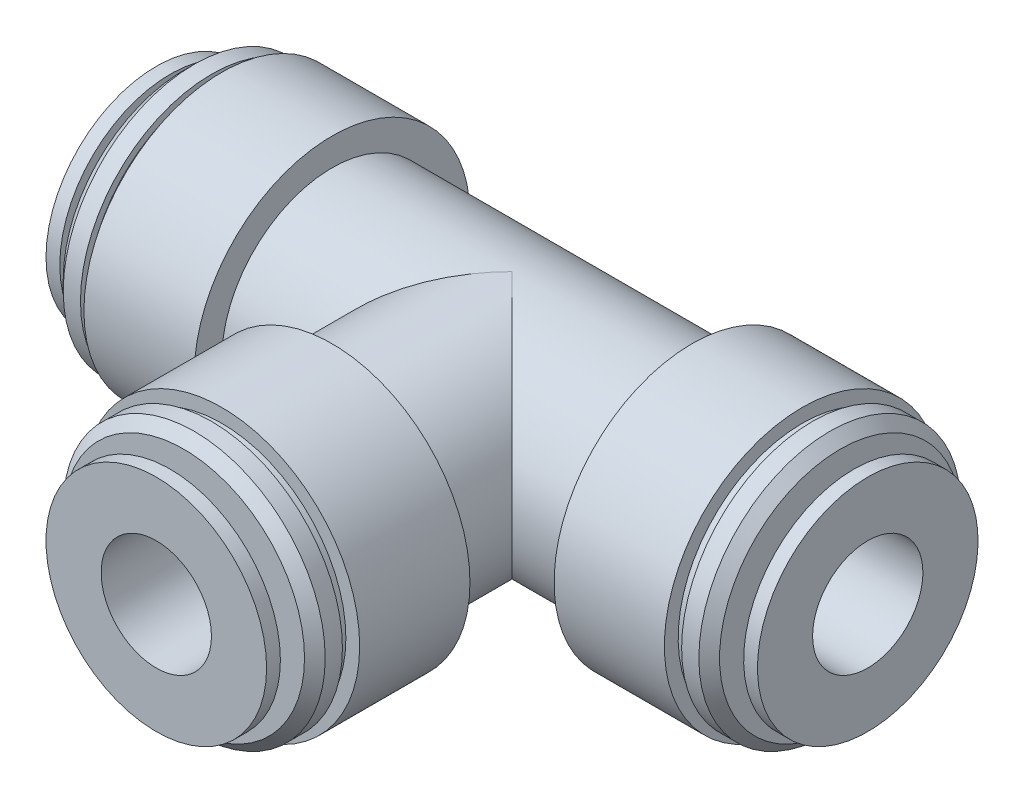
ISO-10303-21;
HEADER;
FILE_DESCRIPTION(('STEP AP214'),'2;1');
FILE_NAME('part.step','',(''),(''),'','','');
FILE_SCHEMA(('AUTOMOTIVE_DESIGN { 1 0 10303 214 1 1 1 1 }'));
ENDSEC;
DATA;
#1=APPLICATION_CONTEXT('core data for automotive mechanical design processes');
#2=APPLICATION_PROTOCOL_DEFINITION('international standard','automotive_design',2000,#1);
#3=PRODUCT_CONTEXT('',#1,'mechanical');
#4=PRODUCT('Part','Part','',(#3));
#5=PRODUCT_RELATED_PRODUCT_CATEGORY('part','',(#4));
#6=PRODUCT_DEFINITION_FORMATION('','',#4);
#7=PRODUCT_DEFINITION_CONTEXT('part definition',#1,'design');
#8=PRODUCT_DEFINITION('design','',#6,#7);
#9=PRODUCT_DEFINITION_SHAPE('','',#8);
#10=(LENGTH_UNIT() NAMED_UNIT(*) SI_UNIT(.MILLI.,.METRE.));
#11=(NAMED_UNIT(*) PLANE_ANGLE_UNIT() SI_UNIT($,.RADIAN.));
#12=(NAMED_UNIT(*) SI_UNIT($,.STERADIAN.) SOLID_ANGLE_UNIT());
#13=UNCERTAINTY_MEASURE_WITH_UNIT(LENGTH_MEASURE(1.E-05),#10,'distance_accuracy_value','');
#14=(GEOMETRIC_REPRESENTATION_CONTEXT(3) GLOBAL_UNCERTAINTY_ASSIGNED_CONTEXT((#13)) GLOBAL_UNIT_ASSIGNED_CONTEXT((#10,
#11,#12)) REPRESENTATION_CONTEXT('',''));
#15=CARTESIAN_POINT('',(0.,0.,0.));
#16=DIRECTION('',(0.,0.,1.));
#17=DIRECTION('',(1.,0.,0.));
#18=AXIS2_PLACEMENT_3D('',#15,#16,#17);
#19=CARTESIAN_POINT('',(-21.0494892323431,0.,0.));
#20=DIRECTION('',(-1.,0.,0.));
#21=DIRECTION('',(0.,0.,1.));
#22=AXIS2_PLACEMENT_3D('',#19,#20,#21);
#23=CYLINDRICAL_SURFACE('',#22,4.);
#24=CARTESIAN_POINT('',(-17.75,0.,0.));
#25=DIRECTION('',(-1.,0.,0.));
#26=DIRECTION('',(0.,0.,1.));
#27=AXIS2_PLACEMENT_3D('',#24,#25,#26);
#28=CIRCLE('',#27,4.);
#29=CARTESIAN_POINT('',(-17.75,0.,4.));
#30=VERTEX_POINT('',#29);
#31=EDGE_CURVE('E195',#30,#30,#28,.T.);
#32=ORIENTED_EDGE('',*,*,#31,.T.);
#33=EDGE_LOOP('',(#32));
#34=FACE_BOUND('',#33,.T.);
#35=CARTESIAN_POINT('',(33.8500000000001,0.,0.));
#36=DIRECTION('',(1.,0.,0.));
#37=DIRECTION('',(0.,1.,0.));
#38=AXIS2_PLACEMENT_3D('',#35,#36,#37);
#39=CIRCLE('',#38,3.99999999999978);
#40=CARTESIAN_POINT('',(33.8500000000001,3.99999999999987,0.));
#41=VERTEX_POINT('',#40);
#42=EDGE_CURVE('E152',#41,#41,#39,.T.);
#43=ORIENTED_EDGE('',*,*,#42,.T.);
#44=EDGE_LOOP('',(#43));
#45=FACE_BOUND('',#44,.T.);
#46=CARTESIAN_POINT('',(8.05000000000001,0.,0.));
#47=DIRECTION('',(-0.707106781186547,0.,0.707106781186547));
#48=DIRECTION('',(-0.707106781186547,0.,-0.707106781186547));
#49=AXIS2_PLACEMENT_3D('',#46,#47,#48);
#50=ELLIPSE('',#49,5.65685424949238,4.);
#51=CARTESIAN_POINT('',(8.85000000000001,3.91918358845309,0.799999999999988));
#52=VERTEX_POINT('',#51);
#53=CARTESIAN_POINT('',(8.85000000000001,-3.91918358845309,0.799999999999988));
#54=VERTEX_POINT('',#53);
#55=EDGE_CURVE('E76',#52,#54,#50,.F.);
#56=ORIENTED_EDGE('',*,*,#55,.F.);
#57=DIRECTION('',(-1.,0.,0.));
#58=VECTOR('',#57,1.);
#59=CARTESIAN_POINT('',(-21.0494892323431,3.91918358845309,0.799999999999988));
#60=LINE('',#59,#58);
#61=CARTESIAN_POINT('',(7.25000000000003,3.91918358845309,0.799999999999988));
#62=VERTEX_POINT('',#61);
#63=EDGE_CURVE('E11',#52,#62,#60,.T.);
#64=ORIENTED_EDGE('',*,*,#63,.T.);
#65=CARTESIAN_POINT('',(8.05000000000001,0.,0.));
#66=DIRECTION('',(-0.707106781186547,0.,-0.707106781186547));
#67=DIRECTION('',(-0.707106781186547,0.,0.707106781186547));
#68=AXIS2_PLACEMENT_3D('',#65,#66,#67);
#69=ELLIPSE('',#68,5.65685424949238,4.);
#70=CARTESIAN_POINT('',(7.25000000000003,-3.91918358845309,0.799999999999988));
#71=VERTEX_POINT('',#70);
#72=EDGE_CURVE('E78',#71,#62,#69,.T.);
#73=ORIENTED_EDGE('',*,*,#72,.F.);
#74=DIRECTION('',(-1.,0.,0.));
#75=VECTOR('',#74,1.);
#76=CARTESIAN_POINT('',(-21.0494892323431,-3.91918358845309,0.799999999999988));
#77=LINE('',#76,#75);
#78=EDGE_CURVE('E42',#71,#54,#77,.F.);
#79=ORIENTED_EDGE('',*,*,#78,.T.);
#80=EDGE_LOOP('',(#56,#64,#73,#79));
#81=FACE_BOUND('',#80,.T.);
#82=ADVANCED_FACE('F34',(#34,#45,#81),#23,.F.);
#83=CARTESIAN_POINT('',(21.1,0.,0.));
#84=DIRECTION('',(-1.,0.,0.));
#85=DIRECTION('',(0.,0.,1.));
#86=AXIS2_PLACEMENT_3D('',#83,#84,#85);
#87=CYLINDRICAL_SURFACE('',#86,8.);
#88=CARTESIAN_POINT('',(-4.99999999999998,0.,0.));
#89=DIRECTION('',(1.,0.,0.));
#90=DIRECTION('',(0.,0.,-1.));
#91=AXIS2_PLACEMENT_3D('',#88,#89,#90);
#92=CIRCLE('',#91,8.);
#93=CARTESIAN_POINT('',(-4.99999999999998,0.,-8.));
#94=VERTEX_POINT('',#93);
#95=EDGE_CURVE('E162',#94,#94,#92,.T.);
#96=ORIENTED_EDGE('',*,*,#95,.T.);
#97=EDGE_LOOP('',(#96));
#98=FACE_BOUND('',#97,.T.);
#99=CARTESIAN_POINT('',(21.1,0.,0.));
#100=DIRECTION('',(1.,0.,0.));
#101=DIRECTION('',(0.,0.,-1.));
#102=AXIS2_PLACEMENT_3D('',#99,#100,#101);
#103=CIRCLE('',#102,8.);
#104=CARTESIAN_POINT('',(21.1,0.,-8.));
#105=VERTEX_POINT('',#104);
#106=EDGE_CURVE('E158',#105,#105,#103,.T.);
#107=ORIENTED_EDGE('',*,*,#106,.F.);
#108=EDGE_LOOP('',(#107));
#109=FACE_BOUND('',#108,.T.);
#110=CARTESIAN_POINT('',(8.05000000000002,0.,0.));
#111=DIRECTION('',(-0.707106781186547,0.,-0.707106781186547));
#112=DIRECTION('',(-0.707106781186547,0.,0.707106781186547));
#113=AXIS2_PLACEMENT_3D('',#110,#111,#112);
#114=ELLIPSE('',#113,11.3137084989848,8.);
#115=CARTESIAN_POINT('',(8.05000000000002,8.,0.));
#116=VERTEX_POINT('',#115);
#117=CARTESIAN_POINT('',(8.05000000000002,-8.,0.));
#118=VERTEX_POINT('',#117);
#119=EDGE_CURVE('E201',#116,#118,#114,.F.);
#120=ORIENTED_EDGE('',*,*,#119,.F.);
#121=CARTESIAN_POINT('',(8.05000000000002,0.,0.));
#122=DIRECTION('',(-0.707106781186547,0.,0.707106781186547));
#123=DIRECTION('',(-0.707106781186547,0.,-0.707106781186547));
#124=AXIS2_PLACEMENT_3D('',#121,#122,#123);
#125=ELLIPSE('',#124,11.3137084989848,8.);
#126=EDGE_CURVE('E55',#118,#116,#125,.T.);
#127=ORIENTED_EDGE('',*,*,#126,.F.);
#128=EDGE_LOOP('',(#120,#127));
#129=FACE_BOUND('',#128,.T.);
#130=ADVANCED_FACE('F204',(#98,#109,#129),#87,.T.);
#131=CARTESIAN_POINT('',(-21.0494892323431,0.,0.));
#132=DIRECTION('',(-1.,0.,0.));
#133=DIRECTION('',(0.,0.,1.));
#134=AXIS2_PLACEMENT_3D('',#131,#132,#133);
#135=CYLINDRICAL_SURFACE('',#134,10.);
#136=CARTESIAN_POINT('',(-4.99999999999998,0.,0.));
#137=DIRECTION('',(-1.,0.,0.));
#138=DIRECTION('',(0.,0.,1.));
#139=AXIS2_PLACEMENT_3D('',#136,#137,#138);
#140=CIRCLE('',#139,10.);
#141=CARTESIAN_POINT('',(-4.99999999999998,0.,10.));
#142=VERTEX_POINT('',#141);
#143=EDGE_CURVE('E165',#142,#142,#140,.T.);
#144=ORIENTED_EDGE('',*,*,#143,.T.);
#145=EDGE_LOOP('',(#144));
#146=FACE_BOUND('',#145,.T.);
#147=CARTESIAN_POINT('',(-13.,0.,0.));
#148=DIRECTION('',(-1.,0.,0.));
#149=DIRECTION('',(0.,0.,1.));
#150=AXIS2_PLACEMENT_3D('',#147,#148,#149);
#151=CIRCLE('',#150,10.);
#152=CARTESIAN_POINT('',(-13.,0.,10.));
#153=VERTEX_POINT('',#152);
#154=EDGE_CURVE('E161',#153,#153,#151,.T.);
#155=ORIENTED_EDGE('',*,*,#154,.F.);
#156=EDGE_LOOP('',(#155));
#157=FACE_BOUND('',#156,.T.);
#158=ADVANCED_FACE('F36',(#146,#157),#135,.T.);
#159=CARTESIAN_POINT('',(-4.99999999999998,-10.,0.));
#160=DIRECTION('',(1.,0.,0.));
#161=DIRECTION('',(0.,0.,-1.));
#162=AXIS2_PLACEMENT_3D('',#159,#160,#161);
#163=PLANE('',#162);
#164=ORIENTED_EDGE('',*,*,#95,.F.);
#165=EDGE_LOOP('',(#164));
#166=FACE_BOUND('',#165,.T.);
#167=ORIENTED_EDGE('',*,*,#143,.F.);
#168=EDGE_LOOP('',(#167));
#169=FACE_BOUND('',#168,.T.);
#170=ADVANCED_FACE('F212',(#166,#169),#163,.T.);
#171=CARTESIAN_POINT('',(-17.75,-4.,0.));
#172=DIRECTION('',(-1.,0.,0.));
#173=DIRECTION('',(0.,0.,1.));
#174=AXIS2_PLACEMENT_3D('',#171,#172,#173);
#175=PLANE('',#174);
#176=CARTESIAN_POINT('',(-17.75,0.,0.));
#177=DIRECTION('',(-1.,0.,0.));
#178=DIRECTION('',(0.,0.,1.));
#179=AXIS2_PLACEMENT_3D('',#176,#177,#178);
#180=CIRCLE('',#179,8.);
#181=CARTESIAN_POINT('',(-17.75,0.,8.));
#182=VERTEX_POINT('',#181);
#183=EDGE_CURVE('E192',#182,#182,#180,.T.);
#184=ORIENTED_EDGE('',*,*,#183,.T.);
#185=EDGE_LOOP('',(#184));
#186=FACE_BOUND('',#185,.T.);
#187=ORIENTED_EDGE('',*,*,#31,.F.);
#188=EDGE_LOOP('',(#187));
#189=FACE_BOUND('',#188,.T.);
#190=ADVANCED_FACE('F256',(#186,#189),#175,.T.);
#191=CARTESIAN_POINT('',(-21.0494892323431,0.,0.));
#192=DIRECTION('',(-1.,0.,0.));
#193=DIRECTION('',(0.,0.,1.));
#194=AXIS2_PLACEMENT_3D('',#191,#192,#193);
#195=CYLINDRICAL_SURFACE('',#194,8.);
#196=CARTESIAN_POINT('',(-16.7499999999999,0.,0.));
#197=DIRECTION('',(-1.,0.,0.));
#198=DIRECTION('',(0.,0.,1.));
#199=AXIS2_PLACEMENT_3D('',#196,#197,#198);
#200=CIRCLE('',#199,8.);
#201=CARTESIAN_POINT('',(-16.7499999999999,0.,8.));
#202=VERTEX_POINT('',#201);
#203=EDGE_CURVE('E189',#202,#202,#200,.T.);
#204=ORIENTED_EDGE('',*,*,#203,.T.);
#205=EDGE_LOOP('',(#204));
#206=FACE_BOUND('',#205,.T.);
#207=ORIENTED_EDGE('',*,*,#183,.F.);
#208=EDGE_LOOP('',(#207));
#209=FACE_BOUND('',#208,.T.);
#210=ADVANCED_FACE('F252',(#206,#209),#195,.T.);
#211=CARTESIAN_POINT('',(-16.7499999999999,-8.,0.));
#212=DIRECTION('',(1.,0.,0.));
#213=DIRECTION('',(0.,0.,-1.));
#214=AXIS2_PLACEMENT_3D('',#211,#212,#213);
#215=PLANE('',#214);
#216=CARTESIAN_POINT('',(-16.7499999999999,0.,0.));
#217=DIRECTION('',(-1.,0.,0.));
#218=DIRECTION('',(0.,0.,1.));
#219=AXIS2_PLACEMENT_3D('',#216,#217,#218);
#220=CIRCLE('',#219,5.99999999999998);
#221=CARTESIAN_POINT('',(-16.7499999999999,0.,5.99999999999998));
#222=VERTEX_POINT('',#221);
#223=EDGE_CURVE('E186',#222,#222,#220,.T.);
#224=ORIENTED_EDGE('',*,*,#223,.T.);
#225=EDGE_LOOP('',(#224));
#226=FACE_BOUND('',#225,.T.);
#227=ORIENTED_EDGE('',*,*,#203,.F.);
#228=EDGE_LOOP('',(#227));
#229=FACE_BOUND('',#228,.T.);
#230=ADVANCED_FACE('F248',(#226,#229),#215,.T.);
#231=CARTESIAN_POINT('',(-21.0494892323431,0.,0.));
#232=DIRECTION('',(-1.,0.,0.));
#233=DIRECTION('',(0.,0.,1.));
#234=AXIS2_PLACEMENT_3D('',#231,#232,#233);
#235=CYLINDRICAL_SURFACE('',#234,5.99999999999998);
#236=CARTESIAN_POINT('',(-15.75,0.,0.));
#237=DIRECTION('',(-1.,0.,0.));
#238=DIRECTION('',(0.,0.,1.));
#239=AXIS2_PLACEMENT_3D('',#236,#237,#238);
#240=CIRCLE('',#239,5.99999999999998);
#241=CARTESIAN_POINT('',(-15.75,0.,5.99999999999998));
#242=VERTEX_POINT('',#241);
#243=EDGE_CURVE('E183',#242,#242,#240,.T.);
#244=ORIENTED_EDGE('',*,*,#243,.T.);
#245=EDGE_LOOP('',(#244));
#246=FACE_BOUND('',#245,.T.);
#247=ORIENTED_EDGE('',*,*,#223,.F.);
#248=EDGE_LOOP('',(#247));
#249=FACE_BOUND('',#248,.T.);
#250=ADVANCED_FACE('F244',(#246,#249),#235,.T.);
#251=CARTESIAN_POINT('',(-15.75,-5.99999999999998,0.));
#252=DIRECTION('',(-1.,0.,0.));
#253=DIRECTION('',(0.,0.,1.));
#254=AXIS2_PLACEMENT_3D('',#251,#252,#253);
#255=PLANE('',#254);
#256=CARTESIAN_POINT('',(-15.75,0.,0.));
#257=DIRECTION('',(-1.,0.,0.));
#258=DIRECTION('',(0.,0.,1.));
#259=AXIS2_PLACEMENT_3D('',#256,#257,#258);
#260=CIRCLE('',#259,8.74999999999998);
#261=CARTESIAN_POINT('',(-15.75,0.,8.74999999999998));
#262=VERTEX_POINT('',#261);
#263=EDGE_CURVE('E180',#262,#262,#260,.T.);
#264=ORIENTED_EDGE('',*,*,#263,.T.);
#265=EDGE_LOOP('',(#264));
#266=FACE_BOUND('',#265,.T.);
#267=ORIENTED_EDGE('',*,*,#243,.F.);
#268=EDGE_LOOP('',(#267));
#269=FACE_BOUND('',#268,.T.);
#270=ADVANCED_FACE('F240',(#266,#269),#255,.T.);
#271=CARTESIAN_POINT('',(-15.75,0.,0.));
#272=DIRECTION('',(1.,0.,0.));
#273=DIRECTION('',(0.,0.,-1.));
#274=AXIS2_PLACEMENT_3D('',#271,#272,#273);
#275=CONICAL_SURFACE('',#274,8.74999999999998,0.785398163397448);
#276=CARTESIAN_POINT('',(-15.,0.,0.));
#277=DIRECTION('',(-1.,0.,0.));
#278=DIRECTION('',(0.,0.,1.));
#279=AXIS2_PLACEMENT_3D('',#276,#277,#278);
#280=CIRCLE('',#279,9.49999999999998);
#281=CARTESIAN_POINT('',(-15.,0.,9.49999999999998));
#282=VERTEX_POINT('',#281);
#283=EDGE_CURVE('E177',#282,#282,#280,.T.);
#284=ORIENTED_EDGE('',*,*,#283,.T.);
#285=EDGE_LOOP('',(#284));
#286=FACE_BOUND('',#285,.T.);
#287=ORIENTED_EDGE('',*,*,#263,.F.);
#288=EDGE_LOOP('',(#287));
#289=FACE_BOUND('',#288,.T.);
#290=ADVANCED_FACE('F236',(#286,#289),#275,.T.);
#291=CARTESIAN_POINT('',(-21.0494892323431,0.,0.));
#292=DIRECTION('',(-1.,0.,0.));
#293=DIRECTION('',(0.,0.,1.));
#294=AXIS2_PLACEMENT_3D('',#291,#292,#293);
#295=CYLINDRICAL_SURFACE('',#294,9.49999999999998);
#296=CARTESIAN_POINT('',(-13.75,0.,0.));
#297=DIRECTION('',(-1.,0.,0.));
#298=DIRECTION('',(0.,0.,1.));
#299=AXIS2_PLACEMENT_3D('',#296,#297,#298);
#300=CIRCLE('',#299,9.49999999999998);
#301=CARTESIAN_POINT('',(-13.75,0.,9.49999999999998));
#302=VERTEX_POINT('',#301);
#303=EDGE_CURVE('E174',#302,#302,#300,.T.);
#304=ORIENTED_EDGE('',*,*,#303,.T.);
#305=EDGE_LOOP('',(#304));
#306=FACE_BOUND('',#305,.T.);
#307=ORIENTED_EDGE('',*,*,#283,.F.);
#308=EDGE_LOOP('',(#307));
#309=FACE_BOUND('',#308,.T.);
#310=ADVANCED_FACE('F232',(#306,#309),#295,.T.);
#311=CARTESIAN_POINT('',(-13.75,-9.49999999999998,0.));
#312=DIRECTION('',(1.,0.,0.));
#313=DIRECTION('',(0.,0.,-1.));
#314=AXIS2_PLACEMENT_3D('',#311,#312,#313);
#315=PLANE('',#314);
#316=CARTESIAN_POINT('',(-13.75,0.,0.));
#317=DIRECTION('',(-1.,0.,0.));
#318=DIRECTION('',(0.,0.,1.));
#319=AXIS2_PLACEMENT_3D('',#316,#317,#318);
#320=CIRCLE('',#319,8.99999999999996);
#321=CARTESIAN_POINT('',(-13.75,0.,8.99999999999996));
#322=VERTEX_POINT('',#321);
#323=EDGE_CURVE('E171',#322,#322,#320,.T.);
#324=ORIENTED_EDGE('',*,*,#323,.T.);
#325=EDGE_LOOP('',(#324));
#326=FACE_BOUND('',#325,.T.);
#327=ORIENTED_EDGE('',*,*,#303,.F.);
#328=EDGE_LOOP('',(#327));
#329=FACE_BOUND('',#328,.T.);
#330=ADVANCED_FACE('F228',(#326,#329),#315,.T.);
#331=CARTESIAN_POINT('',(-21.0494892323431,0.,0.));
#332=DIRECTION('',(-1.,0.,0.));
#333=DIRECTION('',(0.,0.,1.));
#334=AXIS2_PLACEMENT_3D('',#331,#332,#333);
#335=CYLINDRICAL_SURFACE('',#334,8.99999999999996);
#336=CARTESIAN_POINT('',(-13.,0.,0.));
#337=DIRECTION('',(-1.,0.,0.));
#338=DIRECTION('',(0.,0.,1.));
#339=AXIS2_PLACEMENT_3D('',#336,#337,#338);
#340=CIRCLE('',#339,8.99999999999996);
#341=CARTESIAN_POINT('',(-13.,0.,8.99999999999996));
#342=VERTEX_POINT('',#341);
#343=EDGE_CURVE('E168',#342,#342,#340,.T.);
#344=ORIENTED_EDGE('',*,*,#343,.T.);
#345=EDGE_LOOP('',(#344));
#346=FACE_BOUND('',#345,.T.);
#347=ORIENTED_EDGE('',*,*,#323,.F.);
#348=EDGE_LOOP('',(#347));
#349=FACE_BOUND('',#348,.T.);
#350=ADVANCED_FACE('F224',(#346,#349),#335,.T.);
#351=CARTESIAN_POINT('',(-13.,-8.99999999999996,0.));
#352=DIRECTION('',(-1.,0.,0.));
#353=DIRECTION('',(0.,0.,1.));
#354=AXIS2_PLACEMENT_3D('',#351,#352,#353);
#355=PLANE('',#354);
#356=ORIENTED_EDGE('',*,*,#154,.T.);
#357=EDGE_LOOP('',(#356));
#358=FACE_BOUND('',#357,.T.);
#359=ORIENTED_EDGE('',*,*,#343,.F.);
#360=EDGE_LOOP('',(#359));
#361=FACE_BOUND('',#360,.T.);
#362=ADVANCED_FACE('F221',(#358,#361),#355,.T.);
#363=CARTESIAN_POINT('',(47.149489232343,1.48318857196017E-13,0.));
#364=DIRECTION('',(1.,0.,0.));
#365=DIRECTION('',(0.,1.,0.));
#366=AXIS2_PLACEMENT_3D('',#363,#364,#365);
#367=CYLINDRICAL_SURFACE('',#366,10.);
#368=CARTESIAN_POINT('',(21.1000000000001,0.,0.));
#369=DIRECTION('',(1.,0.,0.));
#370=DIRECTION('',(0.,1.,0.));
#371=AXIS2_PLACEMENT_3D('',#368,#369,#370);
#372=CIRCLE('',#371,10.0000000000001);
#373=CARTESIAN_POINT('',(21.1,10.0000000000001,0.));
#374=VERTEX_POINT('',#373);
#375=EDGE_CURVE('E155',#374,#374,#372,.T.);
#376=ORIENTED_EDGE('',*,*,#375,.T.);
#377=EDGE_LOOP('',(#376));
#378=FACE_BOUND('',#377,.T.);
#379=CARTESIAN_POINT('',(29.1000000000001,0.,0.));
#380=DIRECTION('',(1.,0.,0.));
#381=DIRECTION('',(0.,1.,0.));
#382=AXIS2_PLACEMENT_3D('',#379,#380,#381);
#383=CIRCLE('',#382,10.);
#384=CARTESIAN_POINT('',(29.1,10.0000000000001,0.));
#385=VERTEX_POINT('',#384);
#386=EDGE_CURVE('E122',#385,#385,#383,.T.);
#387=ORIENTED_EDGE('',*,*,#386,.F.);
#388=EDGE_LOOP('',(#387));
#389=FACE_BOUND('',#388,.T.);
#390=ADVANCED_FACE('F219',(#378,#389),#367,.T.);
#391=CARTESIAN_POINT('',(21.1,10.0000000000001,0.));
#392=DIRECTION('',(-1.,0.,0.));
#393=DIRECTION('',(0.,-1.,0.));
#394=AXIS2_PLACEMENT_3D('',#391,#392,#393);
#395=PLANE('',#394);
#396=ORIENTED_EDGE('',*,*,#106,.T.);
#397=EDGE_LOOP('',(#396));
#398=FACE_BOUND('',#397,.T.);
#399=ORIENTED_EDGE('',*,*,#375,.F.);
#400=EDGE_LOOP('',(#399));
#401=FACE_BOUND('',#400,.T.);
#402=ADVANCED_FACE('F295',(#398,#401),#395,.T.);
#403=CARTESIAN_POINT('',(33.8500000000001,3.99999999999987,0.));
#404=DIRECTION('',(1.,0.,0.));
#405=DIRECTION('',(0.,1.,0.));
#406=AXIS2_PLACEMENT_3D('',#403,#404,#405);
#407=PLANE('',#406);
#408=CARTESIAN_POINT('',(33.8500000000002,0.,0.));
#409=DIRECTION('',(1.,0.,0.));
#410=DIRECTION('',(0.,1.,0.));
#411=AXIS2_PLACEMENT_3D('',#408,#409,#410);
#412=CIRCLE('',#411,8.00000000000002);
#413=CARTESIAN_POINT('',(33.8500000000001,8.00000000000011,0.));
#414=VERTEX_POINT('',#413);
#415=EDGE_CURVE('E149',#414,#414,#412,.T.);
#416=ORIENTED_EDGE('',*,*,#415,.T.);
#417=EDGE_LOOP('',(#416));
#418=FACE_BOUND('',#417,.T.);
#419=ORIENTED_EDGE('',*,*,#42,.F.);
#420=EDGE_LOOP('',(#419));
#421=FACE_BOUND('',#420,.T.);
#422=ADVANCED_FACE('F292',(#418,#421),#407,.T.);
#423=CARTESIAN_POINT('',(47.149489232343,1.48318857196017E-13,0.));
#424=DIRECTION('',(1.,0.,0.));
#425=DIRECTION('',(0.,1.,0.));
#426=AXIS2_PLACEMENT_3D('',#423,#424,#425);
#427=CYLINDRICAL_SURFACE('',#426,8.00000000000002);
#428=CARTESIAN_POINT('',(32.85,0.,0.));
#429=DIRECTION('',(1.,0.,0.));
#430=DIRECTION('',(0.,1.,0.));
#431=AXIS2_PLACEMENT_3D('',#428,#429,#430);
#432=CIRCLE('',#431,8.00000000000003);
#433=CARTESIAN_POINT('',(32.85,8.00000000000011,0.));
#434=VERTEX_POINT('',#433);
#435=EDGE_CURVE('E146',#434,#434,#432,.T.);
#436=ORIENTED_EDGE('',*,*,#435,.T.);
#437=EDGE_LOOP('',(#436));
#438=FACE_BOUND('',#437,.T.);
#439=ORIENTED_EDGE('',*,*,#415,.F.);
#440=EDGE_LOOP('',(#439));
#441=FACE_BOUND('',#440,.T.);
#442=ADVANCED_FACE('F294',(#438,#441),#427,.T.);
#443=CARTESIAN_POINT('',(32.85,8.00000000000011,0.));
#444=DIRECTION('',(-1.,0.,0.));
#445=DIRECTION('',(0.,-1.,0.));
#446=AXIS2_PLACEMENT_3D('',#443,#444,#445);
#447=PLANE('',#446);
#448=CARTESIAN_POINT('',(32.85,0.,0.));
#449=DIRECTION('',(1.,0.,0.));
#450=DIRECTION('',(0.,1.,0.));
#451=AXIS2_PLACEMENT_3D('',#448,#449,#450);
#452=CIRCLE('',#451,6.);
#453=CARTESIAN_POINT('',(32.85,6.00000000000008,0.));
#454=VERTEX_POINT('',#453);
#455=EDGE_CURVE('E143',#454,#454,#452,.T.);
#456=ORIENTED_EDGE('',*,*,#455,.T.);
#457=EDGE_LOOP('',(#456));
#458=FACE_BOUND('',#457,.T.);
#459=ORIENTED_EDGE('',*,*,#435,.F.);
#460=EDGE_LOOP('',(#459));
#461=FACE_BOUND('',#460,.T.);
#462=ADVANCED_FACE('F302',(#458,#461),#447,.T.);
#463=CARTESIAN_POINT('',(47.149489232343,1.48318857196017E-13,0.));
#464=DIRECTION('',(1.,0.,0.));
#465=DIRECTION('',(0.,1.,0.));
#466=AXIS2_PLACEMENT_3D('',#463,#464,#465);
#467=CYLINDRICAL_SURFACE('',#466,6.);
#468=CARTESIAN_POINT('',(31.85,0.,0.));
#469=DIRECTION('',(1.,0.,0.));
#470=DIRECTION('',(0.,1.,0.));
#471=AXIS2_PLACEMENT_3D('',#468,#469,#470);
#472=CIRCLE('',#471,6.);
#473=CARTESIAN_POINT('',(31.85,6.00000000000008,0.));
#474=VERTEX_POINT('',#473);
#475=EDGE_CURVE('E140',#474,#474,#472,.T.);
#476=ORIENTED_EDGE('',*,*,#475,.T.);
#477=EDGE_LOOP('',(#476));
#478=FACE_BOUND('',#477,.T.);
#479=ORIENTED_EDGE('',*,*,#455,.F.);
#480=EDGE_LOOP('',(#479));
#481=FACE_BOUND('',#480,.T.);
#482=ADVANCED_FACE('F309',(#478,#481),#467,.T.);
#483=CARTESIAN_POINT('',(31.85,6.00000000000008,0.));
#484=DIRECTION('',(1.,0.,0.));
#485=DIRECTION('',(0.,1.,0.));
#486=AXIS2_PLACEMENT_3D('',#483,#484,#485);
#487=PLANE('',#486);
#488=CARTESIAN_POINT('',(31.8500000000001,0.,0.));
#489=DIRECTION('',(1.,0.,0.));
#490=DIRECTION('',(0.,1.,0.));
#491=AXIS2_PLACEMENT_3D('',#488,#489,#490);
#492=CIRCLE('',#491,8.74999999999999);
#493=CARTESIAN_POINT('',(31.85,8.75000000000007,0.));
#494=VERTEX_POINT('',#493);
#495=EDGE_CURVE('E137',#494,#494,#492,.T.);
#496=ORIENTED_EDGE('',*,*,#495,.T.);
#497=EDGE_LOOP('',(#496));
#498=FACE_BOUND('',#497,.T.);
#499=ORIENTED_EDGE('',*,*,#475,.F.);
#500=EDGE_LOOP('',(#499));
#501=FACE_BOUND('',#500,.T.);
#502=ADVANCED_FACE('F313',(#498,#501),#487,.T.);
#503=CARTESIAN_POINT('',(31.8500000000001,0.,0.));
#504=DIRECTION('',(-1.,0.,0.));
#505=DIRECTION('',(0.,-1.,0.));
#506=AXIS2_PLACEMENT_3D('',#503,#504,#505);
#507=CONICAL_SURFACE('',#506,8.75,0.785398163397451);
#508=CARTESIAN_POINT('',(31.1000000000001,0.,0.));
#509=DIRECTION('',(1.,0.,0.));
#510=DIRECTION('',(0.,1.,0.));
#511=AXIS2_PLACEMENT_3D('',#508,#509,#510);
#512=CIRCLE('',#511,9.5);
#513=CARTESIAN_POINT('',(31.1,9.50000000000007,0.));
#514=VERTEX_POINT('',#513);
#515=EDGE_CURVE('E134',#514,#514,#512,.T.);
#516=ORIENTED_EDGE('',*,*,#515,.T.);
#517=EDGE_LOOP('',(#516));
#518=FACE_BOUND('',#517,.T.);
#519=ORIENTED_EDGE('',*,*,#495,.F.);
#520=EDGE_LOOP('',(#519));
#521=FACE_BOUND('',#520,.T.);
#522=ADVANCED_FACE('F317',(#518,#521),#507,.T.);
#523=CARTESIAN_POINT('',(47.149489232343,1.48318857196017E-13,0.));
#524=DIRECTION('',(1.,0.,0.));
#525=DIRECTION('',(0.,1.,0.));
#526=AXIS2_PLACEMENT_3D('',#523,#524,#525);
#527=CYLINDRICAL_SURFACE('',#526,9.5);
#528=CARTESIAN_POINT('',(29.8500000000001,0.,0.));
#529=DIRECTION('',(1.,0.,0.));
#530=DIRECTION('',(0.,1.,0.));
#531=AXIS2_PLACEMENT_3D('',#528,#529,#530);
#532=CIRCLE('',#531,9.5);
#533=CARTESIAN_POINT('',(29.85,9.50000000000007,0.));
#534=VERTEX_POINT('',#533);
#535=EDGE_CURVE('E131',#534,#534,#532,.T.);
#536=ORIENTED_EDGE('',*,*,#535,.T.);
#537=EDGE_LOOP('',(#536));
#538=FACE_BOUND('',#537,.T.);
#539=ORIENTED_EDGE('',*,*,#515,.F.);
#540=EDGE_LOOP('',(#539));
#541=FACE_BOUND('',#540,.T.);
#542=ADVANCED_FACE('F321',(#538,#541),#527,.T.);
#543=CARTESIAN_POINT('',(29.85,9.50000000000007,0.));
#544=DIRECTION('',(-1.,0.,0.));
#545=DIRECTION('',(0.,-1.,0.));
#546=AXIS2_PLACEMENT_3D('',#543,#544,#545);
#547=PLANE('',#546);
#548=CARTESIAN_POINT('',(29.8500000000001,0.,0.));
#549=DIRECTION('',(1.,0.,0.));
#550=DIRECTION('',(0.,1.,0.));
#551=AXIS2_PLACEMENT_3D('',#548,#549,#550);
#552=CIRCLE('',#551,9.);
#553=CARTESIAN_POINT('',(29.85,9.00000000000007,0.));
#554=VERTEX_POINT('',#553);
#555=EDGE_CURVE('E128',#554,#554,#552,.T.);
#556=ORIENTED_EDGE('',*,*,#555,.T.);
#557=EDGE_LOOP('',(#556));
#558=FACE_BOUND('',#557,.T.);
#559=ORIENTED_EDGE('',*,*,#535,.F.);
#560=EDGE_LOOP('',(#559));
#561=FACE_BOUND('',#560,.T.);
#562=ADVANCED_FACE('F325',(#558,#561),#547,.T.);
#563=CARTESIAN_POINT('',(47.149489232343,1.48318857196017E-13,0.));
#564=DIRECTION('',(1.,0.,0.));
#565=DIRECTION('',(0.,1.,0.));
#566=AXIS2_PLACEMENT_3D('',#563,#564,#565);
#567=CYLINDRICAL_SURFACE('',#566,9.);
#568=CARTESIAN_POINT('',(29.1000000000001,0.,0.));
#569=DIRECTION('',(1.,0.,0.));
#570=DIRECTION('',(0.,1.,0.));
#571=AXIS2_PLACEMENT_3D('',#568,#569,#570);
#572=CIRCLE('',#571,9.);
#573=CARTESIAN_POINT('',(29.1,9.00000000000007,0.));
#574=VERTEX_POINT('',#573);
#575=EDGE_CURVE('E125',#574,#574,#572,.T.);
#576=ORIENTED_EDGE('',*,*,#575,.T.);
#577=EDGE_LOOP('',(#576));
#578=FACE_BOUND('',#577,.T.);
#579=ORIENTED_EDGE('',*,*,#555,.F.);
#580=EDGE_LOOP('',(#579));
#581=FACE_BOUND('',#580,.T.);
#582=ADVANCED_FACE('F329',(#578,#581),#567,.T.);
#583=CARTESIAN_POINT('',(29.1,9.00000000000007,0.));
#584=DIRECTION('',(1.,0.,0.));
#585=DIRECTION('',(0.,1.,0.));
#586=AXIS2_PLACEMENT_3D('',#583,#584,#585);
#587=PLANE('',#586);
#588=ORIENTED_EDGE('',*,*,#386,.T.);
#589=EDGE_LOOP('',(#588));
#590=FACE_BOUND('',#589,.T.);
#591=ORIENTED_EDGE('',*,*,#575,.F.);
#592=EDGE_LOOP('',(#591));
#593=FACE_BOUND('',#592,.T.);
#594=ADVANCED_FACE('F333',(#590,#593),#587,.T.);
#595=CARTESIAN_POINT('',(8.05000000000002,0.,13.05));
#596=DIRECTION('',(0.,0.,-1.));
#597=DIRECTION('',(-1.,0.,0.));
#598=AXIS2_PLACEMENT_3D('',#595,#596,#597);
#599=CYLINDRICAL_SURFACE('',#598,8.);
#600=CARTESIAN_POINT('',(8.05000000000002,0.,13.05));
#601=DIRECTION('',(0.,0.,1.));
#602=DIRECTION('',(1.,0.,0.));
#603=AXIS2_PLACEMENT_3D('',#600,#601,#602);
#604=CIRCLE('',#603,8.);
#605=CARTESIAN_POINT('',(16.05,0.,13.05));
#606=VERTEX_POINT('',#605);
#607=EDGE_CURVE('E119',#606,#606,#604,.T.);
#608=ORIENTED_EDGE('',*,*,#607,.F.);
#609=EDGE_LOOP('',(#608));
#610=FACE_BOUND('',#609,.T.);
#611=ORIENTED_EDGE('',*,*,#126,.T.);
#612=ORIENTED_EDGE('',*,*,#119,.T.);
#613=EDGE_LOOP('',(#611,#612));
#614=FACE_BOUND('',#613,.T.);
#615=ADVANCED_FACE('F203',(#610,#614),#599,.T.);
#616=CARTESIAN_POINT('',(8.05000000000002,0.,29.099489232343));
#617=DIRECTION('',(0.,0.,1.));
#618=DIRECTION('',(1.,0.,0.));
#619=AXIS2_PLACEMENT_3D('',#616,#617,#618);
#620=CYLINDRICAL_SURFACE('',#619,10.);
#621=CARTESIAN_POINT('',(8.05000000000002,0.,13.0499999999998));
#622=DIRECTION('',(0.,0.,1.));
#623=DIRECTION('',(1.,0.,0.));
#624=AXIS2_PLACEMENT_3D('',#621,#622,#623);
#625=CIRCLE('',#624,10.);
#626=CARTESIAN_POINT('',(18.05,0.,13.0499999999998));
#627=VERTEX_POINT('',#626);
#628=EDGE_CURVE('E116',#627,#627,#625,.T.);
#629=ORIENTED_EDGE('',*,*,#628,.T.);
#630=EDGE_LOOP('',(#629));
#631=FACE_BOUND('',#630,.T.);
#632=CARTESIAN_POINT('',(8.05000000000002,0.,21.0499999999999));
#633=DIRECTION('',(0.,0.,1.));
#634=DIRECTION('',(1.,0.,0.));
#635=AXIS2_PLACEMENT_3D('',#632,#633,#634);
#636=CIRCLE('',#635,10.);
#637=CARTESIAN_POINT('',(18.05,0.,21.0499999999999));
#638=VERTEX_POINT('',#637);
#639=EDGE_CURVE('E80',#638,#638,#636,.T.);
#640=ORIENTED_EDGE('',*,*,#639,.F.);
#641=EDGE_LOOP('',(#640));
#642=FACE_BOUND('',#641,.T.);
#643=ADVANCED_FACE('F340',(#631,#642),#620,.T.);
#644=CARTESIAN_POINT('',(18.05,0.,13.0499999999998));
#645=DIRECTION('',(0.,0.,-1.));
#646=DIRECTION('',(-1.,0.,0.));
#647=AXIS2_PLACEMENT_3D('',#644,#645,#646);
#648=PLANE('',#647);
#649=ORIENTED_EDGE('',*,*,#607,.T.);
#650=EDGE_LOOP('',(#649));
#651=FACE_BOUND('',#650,.T.);
#652=ORIENTED_EDGE('',*,*,#628,.F.);
#653=EDGE_LOOP('',(#652));
#654=FACE_BOUND('',#653,.T.);
#655=ADVANCED_FACE('F344',(#651,#654),#648,.T.);
#656=CARTESIAN_POINT('',(8.05000000000002,0.,29.099489232343));
#657=DIRECTION('',(0.,0.,1.));
#658=DIRECTION('',(1.,0.,0.));
#659=AXIS2_PLACEMENT_3D('',#656,#657,#658);
#660=CYLINDRICAL_SURFACE('',#659,3.99999999999979);
#661=CARTESIAN_POINT('',(8.05000000000002,0.,25.8));
#662=DIRECTION('',(0.,0.,1.));
#663=DIRECTION('',(1.,0.,0.));
#664=AXIS2_PLACEMENT_3D('',#661,#662,#663);
#665=CIRCLE('',#664,3.99999999999979);
#666=CARTESIAN_POINT('',(12.0499999999998,0.,25.8));
#667=VERTEX_POINT('',#666);
#668=EDGE_CURVE('E113',#667,#667,#665,.T.);
#669=ORIENTED_EDGE('',*,*,#668,.T.);
#670=EDGE_LOOP('',(#669));
#671=FACE_BOUND('',#670,.T.);
#672=ORIENTED_EDGE('',*,*,#55,.T.);
#673=CARTESIAN_POINT('',(8.05000000000002,0.,0.799999999999988));
#674=DIRECTION('',(0.,0.,1.));
#675=DIRECTION('',(1.,0.,0.));
#676=AXIS2_PLACEMENT_3D('',#673,#674,#675);
#677=CIRCLE('',#676,4.);
#678=EDGE_CURVE('E48',#71,#54,#677,.T.);
#679=ORIENTED_EDGE('',*,*,#678,.F.);
#680=ORIENTED_EDGE('',*,*,#72,.T.);
#681=EDGE_CURVE('E70',#52,#62,#677,.T.);
#682=ORIENTED_EDGE('',*,*,#681,.F.);
#683=EDGE_LOOP('',(#672,#679,#680,#682));
#684=FACE_BOUND('',#683,.T.);
#685=ADVANCED_FACE('F75',(#671,#684),#660,.F.);
#686=CARTESIAN_POINT('',(12.0499999999998,0.,25.8));
#687=DIRECTION('',(0.,0.,1.));
#688=DIRECTION('',(1.,0.,0.));
#689=AXIS2_PLACEMENT_3D('',#686,#687,#688);
#690=PLANE('',#689);
#691=CARTESIAN_POINT('',(8.05000000000002,0.,25.8));
#692=DIRECTION('',(0.,0.,1.));
#693=DIRECTION('',(1.,0.,0.));
#694=AXIS2_PLACEMENT_3D('',#691,#692,#693);
#695=CIRCLE('',#694,8.00000000000001);
#696=CARTESIAN_POINT('',(16.05,0.,25.8));
#697=VERTEX_POINT('',#696);
#698=EDGE_CURVE('E110',#697,#697,#695,.T.);
#699=ORIENTED_EDGE('',*,*,#698,.T.);
#700=EDGE_LOOP('',(#699));
#701=FACE_BOUND('',#700,.T.);
#702=ORIENTED_EDGE('',*,*,#668,.F.);
#703=EDGE_LOOP('',(#702));
#704=FACE_BOUND('',#703,.T.);
#705=ADVANCED_FACE('F351',(#701,#704),#690,.T.);
#706=CARTESIAN_POINT('',(8.05000000000002,0.,29.099489232343));
#707=DIRECTION('',(0.,0.,1.));
#708=DIRECTION('',(1.,0.,0.));
#709=AXIS2_PLACEMENT_3D('',#706,#707,#708);
#710=CYLINDRICAL_SURFACE('',#709,8.00000000000001);
#711=CARTESIAN_POINT('',(8.05000000000002,0.,24.7999999999998));
#712=DIRECTION('',(0.,0.,1.));
#713=DIRECTION('',(1.,0.,0.));
#714=AXIS2_PLACEMENT_3D('',#711,#712,#713);
#715=CIRCLE('',#714,8.00000000000001);
#716=CARTESIAN_POINT('',(16.05,0.,24.7999999999998));
#717=VERTEX_POINT('',#716);
#718=EDGE_CURVE('E107',#717,#717,#715,.T.);
#719=ORIENTED_EDGE('',*,*,#718,.T.);
#720=EDGE_LOOP('',(#719));
#721=FACE_BOUND('',#720,.T.);
#722=ORIENTED_EDGE('',*,*,#698,.F.);
#723=EDGE_LOOP('',(#722));
#724=FACE_BOUND('',#723,.T.);
#725=ADVANCED_FACE('F355',(#721,#724),#710,.T.);
#726=CARTESIAN_POINT('',(16.05,0.,24.7999999999998));
#727=DIRECTION('',(0.,0.,-1.));
#728=DIRECTION('',(-1.,0.,0.));
#729=AXIS2_PLACEMENT_3D('',#726,#727,#728);
#730=PLANE('',#729);
#731=CARTESIAN_POINT('',(8.05000000000002,0.,24.7999999999998));
#732=DIRECTION('',(0.,0.,1.));
#733=DIRECTION('',(1.,0.,0.));
#734=AXIS2_PLACEMENT_3D('',#731,#732,#733);
#735=CIRCLE('',#734,5.99999999999998);
#736=CARTESIAN_POINT('',(14.05,0.,24.7999999999998));
#737=VERTEX_POINT('',#736);
#738=EDGE_CURVE('E104',#737,#737,#735,.T.);
#739=ORIENTED_EDGE('',*,*,#738,.T.);
#740=EDGE_LOOP('',(#739));
#741=FACE_BOUND('',#740,.T.);
#742=ORIENTED_EDGE('',*,*,#718,.F.);
#743=EDGE_LOOP('',(#742));
#744=FACE_BOUND('',#743,.T.);
#745=ADVANCED_FACE('F359',(#741,#744),#730,.T.);
#746=CARTESIAN_POINT('',(8.05000000000002,0.,29.099489232343));
#747=DIRECTION('',(0.,0.,1.));
#748=DIRECTION('',(1.,0.,0.));
#749=AXIS2_PLACEMENT_3D('',#746,#747,#748);
#750=CYLINDRICAL_SURFACE('',#749,5.99999999999998);
#751=CARTESIAN_POINT('',(8.05000000000002,0.,23.7999999999999));
#752=DIRECTION('',(0.,0.,1.));
#753=DIRECTION('',(1.,0.,0.));
#754=AXIS2_PLACEMENT_3D('',#751,#752,#753);
#755=CIRCLE('',#754,5.99999999999998);
#756=CARTESIAN_POINT('',(14.05,0.,23.7999999999999));
#757=VERTEX_POINT('',#756);
#758=EDGE_CURVE('E101',#757,#757,#755,.T.);
#759=ORIENTED_EDGE('',*,*,#758,.T.);
#760=EDGE_LOOP('',(#759));
#761=FACE_BOUND('',#760,.T.);
#762=ORIENTED_EDGE('',*,*,#738,.F.);
#763=EDGE_LOOP('',(#762));
#764=FACE_BOUND('',#763,.T.);
#765=ADVANCED_FACE('F363',(#761,#764),#750,.T.);
#766=CARTESIAN_POINT('',(14.05,0.,23.7999999999999));
#767=DIRECTION('',(0.,0.,1.));
#768=DIRECTION('',(1.,0.,0.));
#769=AXIS2_PLACEMENT_3D('',#766,#767,#768);
#770=PLANE('',#769);
#771=CARTESIAN_POINT('',(8.05000000000002,0.,23.7999999999999));
#772=DIRECTION('',(0.,0.,1.));
#773=DIRECTION('',(1.,0.,0.));
#774=AXIS2_PLACEMENT_3D('',#771,#772,#773);
#775=CIRCLE('',#774,8.74999999999991);
#776=CARTESIAN_POINT('',(16.7999999999999,0.,23.7999999999999));
#777=VERTEX_POINT('',#776);
#778=EDGE_CURVE('E98',#777,#777,#775,.T.);
#779=ORIENTED_EDGE('',*,*,#778,.T.);
#780=EDGE_LOOP('',(#779));
#781=FACE_BOUND('',#780,.T.);
#782=ORIENTED_EDGE('',*,*,#758,.F.);
#783=EDGE_LOOP('',(#782));
#784=FACE_BOUND('',#783,.T.);
#785=ADVANCED_FACE('F367',(#781,#784),#770,.T.);
#786=CARTESIAN_POINT('',(8.05000000000002,0.,23.7999999999999));
#787=DIRECTION('',(0.,0.,-1.));
#788=DIRECTION('',(-1.,0.,0.));
#789=AXIS2_PLACEMENT_3D('',#786,#787,#788);
#790=CONICAL_SURFACE('',#789,8.74999999999991,0.785398163397448);
#791=CARTESIAN_POINT('',(8.05000000000002,0.,23.0499999999999));
#792=DIRECTION('',(0.,0.,1.));
#793=DIRECTION('',(1.,0.,0.));
#794=AXIS2_PLACEMENT_3D('',#791,#792,#793);
#795=CIRCLE('',#794,9.49999999999991);
#796=CARTESIAN_POINT('',(17.5499999999999,0.,23.0499999999999));
#797=VERTEX_POINT('',#796);
#798=EDGE_CURVE('E95',#797,#797,#795,.T.);
#799=ORIENTED_EDGE('',*,*,#798,.T.);
#800=EDGE_LOOP('',(#799));
#801=FACE_BOUND('',#800,.T.);
#802=ORIENTED_EDGE('',*,*,#778,.F.);
#803=EDGE_LOOP('',(#802));
#804=FACE_BOUND('',#803,.T.);
#805=ADVANCED_FACE('F371',(#801,#804),#790,.T.);
#806=CARTESIAN_POINT('',(8.05000000000002,0.,29.099489232343));
#807=DIRECTION('',(0.,0.,1.));
#808=DIRECTION('',(1.,0.,0.));
#809=AXIS2_PLACEMENT_3D('',#806,#807,#808);
#810=CYLINDRICAL_SURFACE('',#809,9.49999999999991);
#811=CARTESIAN_POINT('',(8.05000000000002,0.,21.7999999999999));
#812=DIRECTION('',(0.,0.,1.));
#813=DIRECTION('',(1.,0.,0.));
#814=AXIS2_PLACEMENT_3D('',#811,#812,#813);
#815=CIRCLE('',#814,9.49999999999991);
#816=CARTESIAN_POINT('',(17.5499999999999,0.,21.7999999999999));
#817=VERTEX_POINT('',#816);
#818=EDGE_CURVE('E92',#817,#817,#815,.T.);
#819=ORIENTED_EDGE('',*,*,#818,.T.);
#820=EDGE_LOOP('',(#819));
#821=FACE_BOUND('',#820,.T.);
#822=ORIENTED_EDGE('',*,*,#798,.F.);
#823=EDGE_LOOP('',(#822));
#824=FACE_BOUND('',#823,.T.);
#825=ADVANCED_FACE('F375',(#821,#824),#810,.T.);
#826=CARTESIAN_POINT('',(17.5499999999999,0.,21.7999999999999));
#827=DIRECTION('',(0.,0.,-1.));
#828=DIRECTION('',(-1.,0.,0.));
#829=AXIS2_PLACEMENT_3D('',#826,#827,#828);
#830=PLANE('',#829);
#831=CARTESIAN_POINT('',(8.05000000000002,0.,21.7999999999999));
#832=DIRECTION('',(0.,0.,1.));
#833=DIRECTION('',(1.,0.,0.));
#834=AXIS2_PLACEMENT_3D('',#831,#832,#833);
#835=CIRCLE('',#834,8.99999999999996);
#836=CARTESIAN_POINT('',(17.05,0.,21.7999999999999));
#837=VERTEX_POINT('',#836);
#838=EDGE_CURVE('E89',#837,#837,#835,.T.);
#839=ORIENTED_EDGE('',*,*,#838,.T.);
#840=EDGE_LOOP('',(#839));
#841=FACE_BOUND('',#840,.T.);
#842=ORIENTED_EDGE('',*,*,#818,.F.);
#843=EDGE_LOOP('',(#842));
#844=FACE_BOUND('',#843,.T.);
#845=ADVANCED_FACE('F379',(#841,#844),#830,.T.);
#846=CARTESIAN_POINT('',(8.05000000000002,0.,29.099489232343));
#847=DIRECTION('',(0.,0.,1.));
#848=DIRECTION('',(1.,0.,0.));
#849=AXIS2_PLACEMENT_3D('',#846,#847,#848);
#850=CYLINDRICAL_SURFACE('',#849,8.99999999999996);
#851=CARTESIAN_POINT('',(8.05000000000002,0.,21.0499999999999));
#852=DIRECTION('',(0.,0.,1.));
#853=DIRECTION('',(1.,0.,0.));
#854=AXIS2_PLACEMENT_3D('',#851,#852,#853);
#855=CIRCLE('',#854,8.99999999999996);
#856=CARTESIAN_POINT('',(17.05,0.,21.0499999999999));
#857=VERTEX_POINT('',#856);
#858=EDGE_CURVE('E83',#857,#857,#855,.T.);
#859=ORIENTED_EDGE('',*,*,#858,.T.);
#860=EDGE_LOOP('',(#859));
#861=FACE_BOUND('',#860,.T.);
#862=ORIENTED_EDGE('',*,*,#838,.F.);
#863=EDGE_LOOP('',(#862));
#864=FACE_BOUND('',#863,.T.);
#865=ADVANCED_FACE('F383',(#861,#864),#850,.T.);
#866=CARTESIAN_POINT('',(17.05,0.,21.0499999999999));
#867=DIRECTION('',(0.,0.,1.));
#868=DIRECTION('',(1.,0.,0.));
#869=AXIS2_PLACEMENT_3D('',#866,#867,#868);
#870=PLANE('',#869);
#871=ORIENTED_EDGE('',*,*,#639,.T.);
#872=EDGE_LOOP('',(#871));
#873=FACE_BOUND('',#872,.T.);
#874=ORIENTED_EDGE('',*,*,#858,.F.);
#875=EDGE_LOOP('',(#874));
#876=FACE_BOUND('',#875,.T.);
#877=ADVANCED_FACE('F387',(#873,#876),#870,.T.);
#878=CARTESIAN_POINT('',(8.05000000000002,0.,0.799999999999988));
#879=DIRECTION('',(0.,0.,1.));
#880=DIRECTION('',(1.,0.,0.));
#881=AXIS2_PLACEMENT_3D('',#878,#879,#880);
#882=PLANE('',#881);
#883=ORIENTED_EDGE('',*,*,#681,.T.);
#884=ORIENTED_EDGE('',*,*,#63,.F.);
#885=EDGE_LOOP('',(#883,#884));
#886=FACE_BOUND('',#885,.T.);
#887=ADVANCED_FACE('F69',(#886),#882,.T.);
#888=ORIENTED_EDGE('',*,*,#678,.T.);
#889=ORIENTED_EDGE('',*,*,#78,.F.);
#890=EDGE_LOOP('',(#888,#889));
#891=FACE_BOUND('',#890,.T.);
#892=ADVANCED_FACE('F392',(#891),#882,.T.);
#893=CLOSED_SHELL('',(#82,#130,#158,#170,#190,#210,#230,#250,#270,#290,#310,#330,#350,#362,#390,
#402,#422,#442,#462,#482,#502,#522,#542,#562,#582,#594,#615,#643,#655,#685,#705,#725,#745,#765,
#785,#805,#825,#845,#865,#877,#887,#892));
#894=MANIFOLD_SOLID_BREP('B2',#893);
#895=ADVANCED_BREP_SHAPE_REPRESENTATION('',(#18,#894),#14);
#896=SHAPE_DEFINITION_REPRESENTATION(#9,#895);
ENDSEC;
END-ISO-10303-21;
